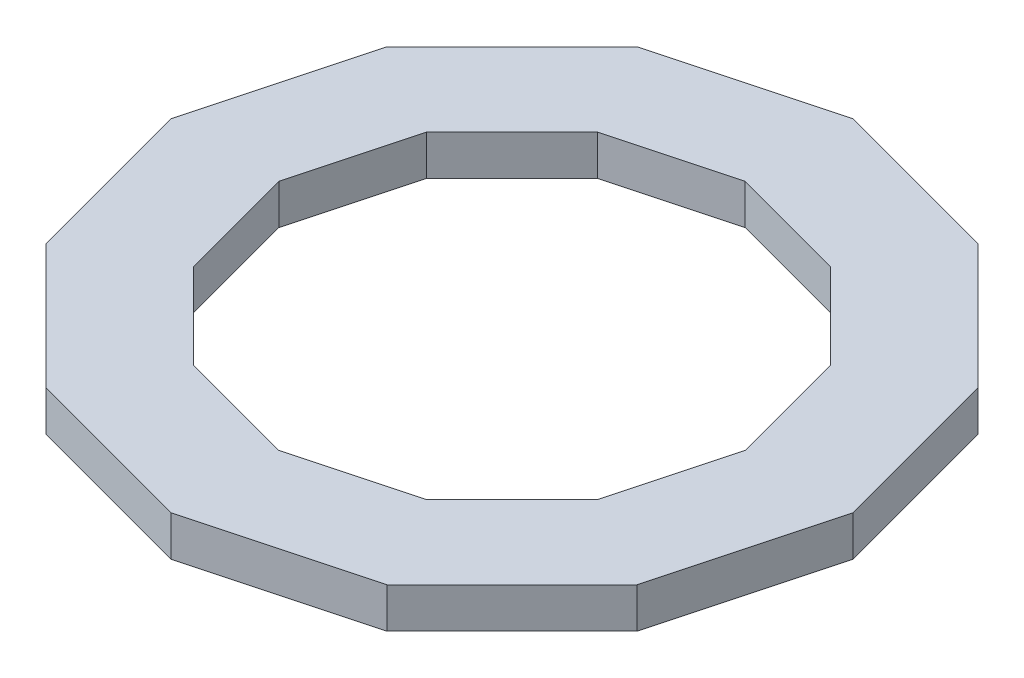
ISO-10303-21;
HEADER;
FILE_DESCRIPTION(('STEP AP214'),'2;1');
FILE_NAME('part.step','',(''),(''),'','','');
FILE_SCHEMA(('AUTOMOTIVE_DESIGN { 1 0 10303 214 1 1 1 1 }'));
ENDSEC;
DATA;
#1=APPLICATION_CONTEXT('core data for automotive mechanical design processes');
#2=APPLICATION_PROTOCOL_DEFINITION('international standard','automotive_design',2000,#1);
#3=PRODUCT_CONTEXT('',#1,'mechanical');
#4=PRODUCT('Part','Part','',(#3));
#5=PRODUCT_RELATED_PRODUCT_CATEGORY('part','',(#4));
#6=PRODUCT_DEFINITION_FORMATION('','',#4);
#7=PRODUCT_DEFINITION_CONTEXT('part definition',#1,'design');
#8=PRODUCT_DEFINITION('design','',#6,#7);
#9=PRODUCT_DEFINITION_SHAPE('','',#8);
#10=(LENGTH_UNIT() NAMED_UNIT(*) SI_UNIT(.MILLI.,.METRE.));
#11=(NAMED_UNIT(*) PLANE_ANGLE_UNIT() SI_UNIT($,.RADIAN.));
#12=(NAMED_UNIT(*) SI_UNIT($,.STERADIAN.) SOLID_ANGLE_UNIT());
#13=UNCERTAINTY_MEASURE_WITH_UNIT(LENGTH_MEASURE(1.E-05),#10,'distance_accuracy_value','');
#14=(GEOMETRIC_REPRESENTATION_CONTEXT(3) GLOBAL_UNCERTAINTY_ASSIGNED_CONTEXT((#13)) GLOBAL_UNIT_ASSIGNED_CONTEXT((#10,
#11,#12)) REPRESENTATION_CONTEXT('',''));
#15=CARTESIAN_POINT('',(0.,0.,0.));
#16=DIRECTION('',(0.,0.,1.));
#17=DIRECTION('',(1.,0.,0.));
#18=AXIS2_PLACEMENT_3D('',#15,#16,#17);
#19=CARTESIAN_POINT('',(0.,19.05,0.));
#20=DIRECTION('',(0.,1.,0.));
#21=DIRECTION('',(0.,0.,1.));
#22=AXIS2_PLACEMENT_3D('',#19,#20,#21);
#23=PLANE('',#22);
#24=DIRECTION('',(-0.258819045102521,0.,0.965925826289068));
#25=VECTOR('',#24,1.);
#26=CARTESIAN_POINT('',(-140.233593158606,19.05,-80.9639027595497));
#27=LINE('',#26,#25);
#28=CARTESIAN_POINT('',(-140.233593158606,19.05,-80.9639027595497));
#29=VERTEX_POINT('',#28);
#30=CARTESIAN_POINT('',(-161.927805519099,19.05,0.));
#31=VERTEX_POINT('',#30);
#32=EDGE_CURVE('E295',#29,#31,#27,.T.);
#33=ORIENTED_EDGE('',*,*,#32,.T.);
#34=DIRECTION('',(0.258819045102521,0.,0.965925826289068));
#35=VECTOR('',#34,1.);
#36=CARTESIAN_POINT('',(-161.927805519099,19.05,0.));
#37=LINE('',#36,#35);
#38=CARTESIAN_POINT('',(-140.233593158606,19.05,80.9639027595497));
#39=VERTEX_POINT('',#38);
#40=EDGE_CURVE('E298',#31,#39,#37,.T.);
#41=ORIENTED_EDGE('',*,*,#40,.T.);
#42=DIRECTION('',(0.707106781186547,0.,0.707106781186547));
#43=VECTOR('',#42,1.);
#44=CARTESIAN_POINT('',(-140.233593158606,19.05,80.9639027595497));
#45=LINE('',#44,#43);
#46=CARTESIAN_POINT('',(-80.9639027595497,19.05,140.233593158606));
#47=VERTEX_POINT('',#46);
#48=EDGE_CURVE('E302',#39,#47,#45,.T.);
#49=ORIENTED_EDGE('',*,*,#48,.T.);
#50=DIRECTION('',(0.965925826289068,0.,0.258819045102521));
#51=VECTOR('',#50,1.);
#52=CARTESIAN_POINT('',(-80.9639027595497,19.05,140.233593158606));
#53=LINE('',#52,#51);
#54=CARTESIAN_POINT('',(0.,19.05,161.927805519099));
#55=VERTEX_POINT('',#54);
#56=EDGE_CURVE('E304',#47,#55,#53,.T.);
#57=ORIENTED_EDGE('',*,*,#56,.T.);
#58=DIRECTION('',(0.965925826289068,0.,-0.258819045102521));
#59=VECTOR('',#58,1.);
#60=CARTESIAN_POINT('',(0.,19.05,161.927805519099));
#61=LINE('',#60,#59);
#62=CARTESIAN_POINT('',(80.9639027595496,19.05,140.233593158606));
#63=VERTEX_POINT('',#62);
#64=EDGE_CURVE('E306',#55,#63,#61,.T.);
#65=ORIENTED_EDGE('',*,*,#64,.T.);
#66=DIRECTION('',(0.707106781186547,0.,-0.707106781186548));
#67=VECTOR('',#66,1.);
#68=CARTESIAN_POINT('',(80.9639027595496,19.05,140.233593158606));
#69=LINE('',#68,#67);
#70=CARTESIAN_POINT('',(140.233593158606,19.05,80.9639027595496));
#71=VERTEX_POINT('',#70);
#72=EDGE_CURVE('E308',#63,#71,#69,.T.);
#73=ORIENTED_EDGE('',*,*,#72,.T.);
#74=DIRECTION('',(0.258819045102521,0.,-0.965925826289068));
#75=VECTOR('',#74,1.);
#76=CARTESIAN_POINT('',(140.233593158606,19.05,80.9639027595496));
#77=LINE('',#76,#75);
#78=CARTESIAN_POINT('',(161.927805519099,19.05,0.));
#79=VERTEX_POINT('',#78);
#80=EDGE_CURVE('E310',#71,#79,#77,.T.);
#81=ORIENTED_EDGE('',*,*,#80,.T.);
#82=DIRECTION('',(-0.258819045102521,0.,-0.965925826289068));
#83=VECTOR('',#82,1.);
#84=CARTESIAN_POINT('',(161.927805519099,19.05,0.));
#85=LINE('',#84,#83);
#86=CARTESIAN_POINT('',(140.233593158606,19.05,-80.9639027595496));
#87=VERTEX_POINT('',#86);
#88=EDGE_CURVE('E312',#79,#87,#85,.T.);
#89=ORIENTED_EDGE('',*,*,#88,.T.);
#90=DIRECTION('',(-0.707106781186547,0.,-0.707106781186548));
#91=VECTOR('',#90,1.);
#92=CARTESIAN_POINT('',(140.233593158606,19.05,-80.9639027595496));
#93=LINE('',#92,#91);
#94=CARTESIAN_POINT('',(80.9639027595496,19.05,-140.233593158606));
#95=VERTEX_POINT('',#94);
#96=EDGE_CURVE('E315',#87,#95,#93,.T.);
#97=ORIENTED_EDGE('',*,*,#96,.T.);
#98=DIRECTION('',(-0.965925826289068,0.,-0.258819045102521));
#99=VECTOR('',#98,1.);
#100=CARTESIAN_POINT('',(80.9639027595496,19.05,-140.233593158606));
#101=LINE('',#100,#99);
#102=CARTESIAN_POINT('',(0.,19.05,-161.927805519099));
#103=VERTEX_POINT('',#102);
#104=EDGE_CURVE('E317',#95,#103,#101,.T.);
#105=ORIENTED_EDGE('',*,*,#104,.T.);
#106=DIRECTION('',(-0.965925826289068,0.,0.258819045102521));
#107=VECTOR('',#106,1.);
#108=CARTESIAN_POINT('',(0.,19.05,-161.927805519099));
#109=LINE('',#108,#107);
#110=CARTESIAN_POINT('',(-80.9639027595496,19.05,-140.233593158606));
#111=VERTEX_POINT('',#110);
#112=EDGE_CURVE('E320',#103,#111,#109,.T.);
#113=ORIENTED_EDGE('',*,*,#112,.T.);
#114=DIRECTION('',(-0.707106781186548,0.,0.707106781186547));
#115=VECTOR('',#114,1.);
#116=CARTESIAN_POINT('',(-80.9639027595496,19.05,-140.233593158606));
#117=LINE('',#116,#115);
#118=EDGE_CURVE('E322',#111,#29,#117,.T.);
#119=ORIENTED_EDGE('',*,*,#118,.T.);
#120=EDGE_LOOP('',(#33,#41,#49,#57,#65,#73,#81,#89,#97,#105,#113,#119));
#121=FACE_BOUND('',#120,.T.);
#122=DIRECTION('',(0.258819045102521,0.,0.965925826289068));
#123=VECTOR('',#122,1.);
#124=CARTESIAN_POINT('',(-110.650576303388,19.05,0.));
#125=LINE('',#124,#123);
#126=CARTESIAN_POINT('',(-110.650576303388,19.05,0.));
#127=VERTEX_POINT('',#126);
#128=CARTESIAN_POINT('',(-95.8262100221223,19.05,55.3252881516939));
#129=VERTEX_POINT('',#128);
#130=EDGE_CURVE('E204',#127,#129,#125,.T.);
#131=ORIENTED_EDGE('',*,*,#130,.F.);
#132=DIRECTION('',(-0.258819045102521,0.,0.965925826289068));
#133=VECTOR('',#132,1.);
#134=CARTESIAN_POINT('',(-95.8262100221223,19.05,-55.3252881516939));
#135=LINE('',#134,#133);
#136=CARTESIAN_POINT('',(-95.8262100221223,19.05,-55.3252881516939));
#137=VERTEX_POINT('',#136);
#138=EDGE_CURVE('E196',#137,#127,#135,.T.);
#139=ORIENTED_EDGE('',*,*,#138,.F.);
#140=DIRECTION('',(-0.707106781186547,0.,0.707106781186548));
#141=VECTOR('',#140,1.);
#142=CARTESIAN_POINT('',(-55.3252881516939,19.05,-95.8262100221223));
#143=LINE('',#142,#141);
#144=CARTESIAN_POINT('',(-55.3252881516939,19.05,-95.8262100221223));
#145=VERTEX_POINT('',#144);
#146=EDGE_CURVE('E239',#145,#137,#143,.T.);
#147=ORIENTED_EDGE('',*,*,#146,.F.);
#148=DIRECTION('',(-0.965925826289068,0.,0.258819045102521));
#149=VECTOR('',#148,1.);
#150=CARTESIAN_POINT('',(0.,19.05,-110.650576303388));
#151=LINE('',#150,#149);
#152=CARTESIAN_POINT('',(0.,19.05,-110.650576303388));
#153=VERTEX_POINT('',#152);
#154=EDGE_CURVE('E236',#153,#145,#151,.T.);
#155=ORIENTED_EDGE('',*,*,#154,.F.);
#156=DIRECTION('',(-0.965925826289068,0.,-0.258819045102521));
#157=VECTOR('',#156,1.);
#158=CARTESIAN_POINT('',(55.3252881516939,19.05,-95.8262100221224));
#159=LINE('',#158,#157);
#160=CARTESIAN_POINT('',(55.3252881516939,19.05,-95.8262100221224));
#161=VERTEX_POINT('',#160);
#162=EDGE_CURVE('E234',#161,#153,#159,.T.);
#163=ORIENTED_EDGE('',*,*,#162,.F.);
#164=DIRECTION('',(-0.707106781186548,0.,-0.707106781186547));
#165=VECTOR('',#164,1.);
#166=CARTESIAN_POINT('',(95.8262100221223,19.05,-55.3252881516939));
#167=LINE('',#166,#165);
#168=CARTESIAN_POINT('',(95.8262100221223,19.05,-55.3252881516939));
#169=VERTEX_POINT('',#168);
#170=EDGE_CURVE('E232',#169,#161,#167,.T.);
#171=ORIENTED_EDGE('',*,*,#170,.F.);
#172=DIRECTION('',(-0.258819045102521,0.,-0.965925826289068));
#173=VECTOR('',#172,1.);
#174=CARTESIAN_POINT('',(110.650576303388,19.05,0.));
#175=LINE('',#174,#173);
#176=CARTESIAN_POINT('',(110.650576303388,19.05,0.));
#177=VERTEX_POINT('',#176);
#178=EDGE_CURVE('E230',#177,#169,#175,.T.);
#179=ORIENTED_EDGE('',*,*,#178,.F.);
#180=DIRECTION('',(0.258819045102521,0.,-0.965925826289068));
#181=VECTOR('',#180,1.);
#182=CARTESIAN_POINT('',(95.8262100221223,19.05,55.3252881516939));
#183=LINE('',#182,#181);
#184=CARTESIAN_POINT('',(95.8262100221223,19.05,55.3252881516939));
#185=VERTEX_POINT('',#184);
#186=EDGE_CURVE('E228',#185,#177,#183,.T.);
#187=ORIENTED_EDGE('',*,*,#186,.F.);
#188=DIRECTION('',(0.707106781186547,0.,-0.707106781186548));
#189=VECTOR('',#188,1.);
#190=CARTESIAN_POINT('',(55.3252881516939,19.05,95.8262100221223));
#191=LINE('',#190,#189);
#192=CARTESIAN_POINT('',(55.3252881516939,19.05,95.8262100221223));
#193=VERTEX_POINT('',#192);
#194=EDGE_CURVE('E226',#193,#185,#191,.T.);
#195=ORIENTED_EDGE('',*,*,#194,.F.);
#196=DIRECTION('',(0.965925826289068,0.,-0.258819045102521));
#197=VECTOR('',#196,1.);
#198=CARTESIAN_POINT('',(0.,19.05,110.650576303388));
#199=LINE('',#198,#197);
#200=CARTESIAN_POINT('',(0.,19.05,110.650576303388));
#201=VERTEX_POINT('',#200);
#202=EDGE_CURVE('E223',#201,#193,#199,.T.);
#203=ORIENTED_EDGE('',*,*,#202,.F.);
#204=DIRECTION('',(0.965925826289068,0.,0.258819045102521));
#205=VECTOR('',#204,1.);
#206=CARTESIAN_POINT('',(-55.3252881516939,19.05,95.8262100221223));
#207=LINE('',#206,#205);
#208=CARTESIAN_POINT('',(-55.3252881516939,19.05,95.8262100221223));
#209=VERTEX_POINT('',#208);
#210=EDGE_CURVE('E219',#209,#201,#207,.T.);
#211=ORIENTED_EDGE('',*,*,#210,.F.);
#212=DIRECTION('',(0.707106781186548,0.,0.707106781186547));
#213=VECTOR('',#212,1.);
#214=CARTESIAN_POINT('',(-95.8262100221223,19.05,55.3252881516939));
#215=LINE('',#214,#213);
#216=EDGE_CURVE('E217',#129,#209,#215,.T.);
#217=ORIENTED_EDGE('',*,*,#216,.F.);
#218=EDGE_LOOP('',(#131,#139,#147,#155,#163,#171,#179,#187,#195,#203,#211,#217));
#219=FACE_BOUND('',#218,.T.);
#220=ADVANCED_FACE('F35',(#121,#219),#23,.T.);
#221=CARTESIAN_POINT('',(0.,0.,0.));
#222=DIRECTION('',(0.,1.,0.));
#223=DIRECTION('',(0.,0.,1.));
#224=AXIS2_PLACEMENT_3D('',#221,#222,#223);
#225=PLANE('',#224);
#226=DIRECTION('',(-0.258819045102521,0.,0.965925826289068));
#227=VECTOR('',#226,1.);
#228=CARTESIAN_POINT('',(-140.233593158606,0.,-80.9639027595497));
#229=LINE('',#228,#227);
#230=CARTESIAN_POINT('',(-140.233593158606,0.,-80.9639027595497));
#231=VERTEX_POINT('',#230);
#232=CARTESIAN_POINT('',(-161.927805519099,0.,0.));
#233=VERTEX_POINT('',#232);
#234=EDGE_CURVE('E212',#231,#233,#229,.T.);
#235=ORIENTED_EDGE('',*,*,#234,.F.);
#236=DIRECTION('',(-0.707106781186548,0.,0.707106781186547));
#237=VECTOR('',#236,1.);
#238=CARTESIAN_POINT('',(-80.9639027595496,0.,-140.233593158606));
#239=LINE('',#238,#237);
#240=CARTESIAN_POINT('',(-80.9639027595496,0.,-140.233593158606));
#241=VERTEX_POINT('',#240);
#242=EDGE_CURVE('E299',#241,#231,#239,.T.);
#243=ORIENTED_EDGE('',*,*,#242,.F.);
#244=DIRECTION('',(-0.965925826289068,0.,0.258819045102521));
#245=VECTOR('',#244,1.);
#246=CARTESIAN_POINT('',(0.,0.,-161.927805519099));
#247=LINE('',#246,#245);
#248=CARTESIAN_POINT('',(0.,0.,-161.927805519099));
#249=VERTEX_POINT('',#248);
#250=EDGE_CURVE('E347',#249,#241,#247,.T.);
#251=ORIENTED_EDGE('',*,*,#250,.F.);
#252=DIRECTION('',(-0.965925826289068,0.,-0.258819045102521));
#253=VECTOR('',#252,1.);
#254=CARTESIAN_POINT('',(80.9639027595496,0.,-140.233593158606));
#255=LINE('',#254,#253);
#256=CARTESIAN_POINT('',(80.9639027595496,0.,-140.233593158606));
#257=VERTEX_POINT('',#256);
#258=EDGE_CURVE('E344',#257,#249,#255,.T.);
#259=ORIENTED_EDGE('',*,*,#258,.F.);
#260=DIRECTION('',(-0.707106781186547,0.,-0.707106781186548));
#261=VECTOR('',#260,1.);
#262=CARTESIAN_POINT('',(140.233593158606,0.,-80.9639027595496));
#263=LINE('',#262,#261);
#264=CARTESIAN_POINT('',(140.233593158606,0.,-80.9639027595496));
#265=VERTEX_POINT('',#264);
#266=EDGE_CURVE('E342',#265,#257,#263,.T.);
#267=ORIENTED_EDGE('',*,*,#266,.F.);
#268=DIRECTION('',(-0.258819045102521,0.,-0.965925826289068));
#269=VECTOR('',#268,1.);
#270=CARTESIAN_POINT('',(161.927805519099,0.,0.));
#271=LINE('',#270,#269);
#272=CARTESIAN_POINT('',(161.927805519099,0.,0.));
#273=VERTEX_POINT('',#272);
#274=EDGE_CURVE('E340',#273,#265,#271,.T.);
#275=ORIENTED_EDGE('',*,*,#274,.F.);
#276=DIRECTION('',(0.258819045102521,0.,-0.965925826289068));
#277=VECTOR('',#276,1.);
#278=CARTESIAN_POINT('',(140.233593158606,0.,80.9639027595496));
#279=LINE('',#278,#277);
#280=CARTESIAN_POINT('',(140.233593158606,0.,80.9639027595496));
#281=VERTEX_POINT('',#280);
#282=EDGE_CURVE('E338',#281,#273,#279,.T.);
#283=ORIENTED_EDGE('',*,*,#282,.F.);
#284=DIRECTION('',(0.707106781186547,0.,-0.707106781186548));
#285=VECTOR('',#284,1.);
#286=CARTESIAN_POINT('',(80.9639027595496,0.,140.233593158606));
#287=LINE('',#286,#285);
#288=CARTESIAN_POINT('',(80.9639027595496,0.,140.233593158606));
#289=VERTEX_POINT('',#288);
#290=EDGE_CURVE('E336',#289,#281,#287,.T.);
#291=ORIENTED_EDGE('',*,*,#290,.F.);
#292=DIRECTION('',(0.965925826289068,0.,-0.258819045102521));
#293=VECTOR('',#292,1.);
#294=CARTESIAN_POINT('',(0.,0.,161.927805519099));
#295=LINE('',#294,#293);
#296=CARTESIAN_POINT('',(0.,0.,161.927805519099));
#297=VERTEX_POINT('',#296);
#298=EDGE_CURVE('E334',#297,#289,#295,.T.);
#299=ORIENTED_EDGE('',*,*,#298,.F.);
#300=DIRECTION('',(0.965925826289068,0.,0.258819045102521));
#301=VECTOR('',#300,1.);
#302=CARTESIAN_POINT('',(-80.9639027595497,0.,140.233593158606));
#303=LINE('',#302,#301);
#304=CARTESIAN_POINT('',(-80.9639027595497,0.,140.233593158606));
#305=VERTEX_POINT('',#304);
#306=EDGE_CURVE('E331',#305,#297,#303,.T.);
#307=ORIENTED_EDGE('',*,*,#306,.F.);
#308=DIRECTION('',(0.707106781186547,0.,0.707106781186547));
#309=VECTOR('',#308,1.);
#310=CARTESIAN_POINT('',(-140.233593158606,0.,80.9639027595497));
#311=LINE('',#310,#309);
#312=CARTESIAN_POINT('',(-140.233593158606,0.,80.9639027595497));
#313=VERTEX_POINT('',#312);
#314=EDGE_CURVE('E329',#313,#305,#311,.T.);
#315=ORIENTED_EDGE('',*,*,#314,.F.);
#316=DIRECTION('',(0.258819045102521,0.,0.965925826289068));
#317=VECTOR('',#316,1.);
#318=CARTESIAN_POINT('',(-161.927805519099,0.,0.));
#319=LINE('',#318,#317);
#320=EDGE_CURVE('E327',#233,#313,#319,.T.);
#321=ORIENTED_EDGE('',*,*,#320,.F.);
#322=EDGE_LOOP('',(#235,#243,#251,#259,#267,#275,#283,#291,#299,#307,#315,#321));
#323=FACE_BOUND('',#322,.T.);
#324=DIRECTION('',(-0.258819045102521,0.,0.965925826289068));
#325=VECTOR('',#324,1.);
#326=CARTESIAN_POINT('',(-95.8262100221223,0.,-55.3252881516939));
#327=LINE('',#326,#325);
#328=CARTESIAN_POINT('',(-95.8262100221223,0.,-55.3252881516939));
#329=VERTEX_POINT('',#328);
#330=CARTESIAN_POINT('',(-110.650576303388,0.,0.));
#331=VERTEX_POINT('',#330);
#332=EDGE_CURVE('E58',#329,#331,#327,.T.);
#333=ORIENTED_EDGE('',*,*,#332,.T.);
#334=DIRECTION('',(0.258819045102521,0.,0.965925826289068));
#335=VECTOR('',#334,1.);
#336=CARTESIAN_POINT('',(-110.650576303388,0.,0.));
#337=LINE('',#336,#335);
#338=CARTESIAN_POINT('',(-95.8262100221223,0.,55.3252881516939));
#339=VERTEX_POINT('',#338);
#340=EDGE_CURVE('E211',#331,#339,#337,.T.);
#341=ORIENTED_EDGE('',*,*,#340,.T.);
#342=DIRECTION('',(0.707106781186548,0.,0.707106781186547));
#343=VECTOR('',#342,1.);
#344=CARTESIAN_POINT('',(-95.8262100221223,0.,55.3252881516939));
#345=LINE('',#344,#343);
#346=CARTESIAN_POINT('',(-55.3252881516939,0.,95.8262100221223));
#347=VERTEX_POINT('',#346);
#348=EDGE_CURVE('E243',#339,#347,#345,.T.);
#349=ORIENTED_EDGE('',*,*,#348,.T.);
#350=DIRECTION('',(0.965925826289068,0.,0.258819045102521));
#351=VECTOR('',#350,1.);
#352=CARTESIAN_POINT('',(-55.3252881516939,0.,95.8262100221223));
#353=LINE('',#352,#351);
#354=CARTESIAN_POINT('',(0.,0.,110.650576303388));
#355=VERTEX_POINT('',#354);
#356=EDGE_CURVE('E246',#347,#355,#353,.T.);
#357=ORIENTED_EDGE('',*,*,#356,.T.);
#358=DIRECTION('',(0.965925826289068,0.,-0.258819045102521));
#359=VECTOR('',#358,1.);
#360=CARTESIAN_POINT('',(0.,0.,110.650576303388));
#361=LINE('',#360,#359);
#362=CARTESIAN_POINT('',(55.3252881516939,0.,95.8262100221223));
#363=VERTEX_POINT('',#362);
#364=EDGE_CURVE('E249',#355,#363,#361,.T.);
#365=ORIENTED_EDGE('',*,*,#364,.T.);
#366=DIRECTION('',(0.707106781186547,0.,-0.707106781186548));
#367=VECTOR('',#366,1.);
#368=CARTESIAN_POINT('',(55.3252881516939,0.,95.8262100221223));
#369=LINE('',#368,#367);
#370=CARTESIAN_POINT('',(95.8262100221223,0.,55.3252881516939));
#371=VERTEX_POINT('',#370);
#372=EDGE_CURVE('E252',#363,#371,#369,.T.);
#373=ORIENTED_EDGE('',*,*,#372,.T.);
#374=DIRECTION('',(0.258819045102521,0.,-0.965925826289068));
#375=VECTOR('',#374,1.);
#376=CARTESIAN_POINT('',(95.8262100221223,0.,55.3252881516939));
#377=LINE('',#376,#375);
#378=CARTESIAN_POINT('',(110.650576303388,0.,0.));
#379=VERTEX_POINT('',#378);
#380=EDGE_CURVE('E255',#371,#379,#377,.T.);
#381=ORIENTED_EDGE('',*,*,#380,.T.);
#382=DIRECTION('',(-0.258819045102521,0.,-0.965925826289068));
#383=VECTOR('',#382,1.);
#384=CARTESIAN_POINT('',(110.650576303388,0.,0.));
#385=LINE('',#384,#383);
#386=CARTESIAN_POINT('',(95.8262100221223,0.,-55.3252881516939));
#387=VERTEX_POINT('',#386);
#388=EDGE_CURVE('E258',#379,#387,#385,.T.);
#389=ORIENTED_EDGE('',*,*,#388,.T.);
#390=DIRECTION('',(-0.707106781186548,0.,-0.707106781186547));
#391=VECTOR('',#390,1.);
#392=CARTESIAN_POINT('',(95.8262100221223,0.,-55.3252881516939));
#393=LINE('',#392,#391);
#394=CARTESIAN_POINT('',(55.3252881516939,0.,-95.8262100221224));
#395=VERTEX_POINT('',#394);
#396=EDGE_CURVE('E261',#387,#395,#393,.T.);
#397=ORIENTED_EDGE('',*,*,#396,.T.);
#398=DIRECTION('',(-0.965925826289068,0.,-0.258819045102521));
#399=VECTOR('',#398,1.);
#400=CARTESIAN_POINT('',(55.3252881516939,0.,-95.8262100221224));
#401=LINE('',#400,#399);
#402=CARTESIAN_POINT('',(0.,0.,-110.650576303388));
#403=VERTEX_POINT('',#402);
#404=EDGE_CURVE('E264',#395,#403,#401,.T.);
#405=ORIENTED_EDGE('',*,*,#404,.T.);
#406=DIRECTION('',(-0.965925826289068,0.,0.258819045102521));
#407=VECTOR('',#406,1.);
#408=CARTESIAN_POINT('',(0.,0.,-110.650576303388));
#409=LINE('',#408,#407);
#410=CARTESIAN_POINT('',(-55.3252881516939,0.,-95.8262100221223));
#411=VERTEX_POINT('',#410);
#412=EDGE_CURVE('E267',#403,#411,#409,.T.);
#413=ORIENTED_EDGE('',*,*,#412,.T.);
#414=DIRECTION('',(-0.707106781186547,0.,0.707106781186548));
#415=VECTOR('',#414,1.);
#416=CARTESIAN_POINT('',(-55.3252881516939,0.,-95.8262100221223));
#417=LINE('',#416,#415);
#418=EDGE_CURVE('E205',#411,#329,#417,.T.);
#419=ORIENTED_EDGE('',*,*,#418,.T.);
#420=EDGE_LOOP('',(#333,#341,#349,#357,#365,#373,#381,#389,#397,#405,#413,#419));
#421=FACE_BOUND('',#420,.T.);
#422=ADVANCED_FACE('F389',(#323,#421),#225,.F.);
#423=CARTESIAN_POINT('',(-140.233593158606,19.05,-80.9639027595497));
#424=DIRECTION('',(0.965925826289068,0.,0.258819045102521));
#425=DIRECTION('',(0.258819045102521,0.,-0.965925826289068));
#426=AXIS2_PLACEMENT_3D('',#423,#424,#425);
#427=PLANE('',#426);
#428=ORIENTED_EDGE('',*,*,#234,.T.);
#429=DIRECTION('',(0.,-1.,0.));
#430=VECTOR('',#429,1.);
#431=CARTESIAN_POINT('',(-161.927805519099,19.05,0.));
#432=LINE('',#431,#430);
#433=EDGE_CURVE('E11',#31,#233,#432,.T.);
#434=ORIENTED_EDGE('',*,*,#433,.F.);
#435=ORIENTED_EDGE('',*,*,#32,.F.);
#436=DIRECTION('',(0.,-1.,0.));
#437=VECTOR('',#436,1.);
#438=CARTESIAN_POINT('',(-140.233593158606,19.05,-80.9639027595497));
#439=LINE('',#438,#437);
#440=EDGE_CURVE('E324',#29,#231,#439,.T.);
#441=ORIENTED_EDGE('',*,*,#440,.T.);
#442=EDGE_LOOP('',(#428,#434,#435,#441));
#443=FACE_BOUND('',#442,.T.);
#444=ADVANCED_FACE('F37',(#443),#427,.F.);
#445=CARTESIAN_POINT('',(-161.927805519099,19.05,0.));
#446=DIRECTION('',(0.965925826289068,0.,-0.258819045102521));
#447=DIRECTION('',(-0.258819045102521,0.,-0.965925826289068));
#448=AXIS2_PLACEMENT_3D('',#445,#446,#447);
#449=PLANE('',#448);
#450=ORIENTED_EDGE('',*,*,#320,.T.);
#451=DIRECTION('',(0.,-1.,0.));
#452=VECTOR('',#451,1.);
#453=CARTESIAN_POINT('',(-140.233593158606,19.05,80.9639027595497));
#454=LINE('',#453,#452);
#455=EDGE_CURVE('E43',#39,#313,#454,.T.);
#456=ORIENTED_EDGE('',*,*,#455,.F.);
#457=ORIENTED_EDGE('',*,*,#40,.F.);
#458=ORIENTED_EDGE('',*,*,#433,.T.);
#459=EDGE_LOOP('',(#450,#456,#457,#458));
#460=FACE_BOUND('',#459,.T.);
#461=ADVANCED_FACE('F406',(#460),#449,.F.);
#462=CARTESIAN_POINT('',(-140.233593158606,19.05,80.9639027595497));
#463=DIRECTION('',(0.707106781186547,0.,-0.707106781186547));
#464=DIRECTION('',(-0.707106781186548,0.,-0.707106781186548));
#465=AXIS2_PLACEMENT_3D('',#462,#463,#464);
#466=PLANE('',#465);
#467=ORIENTED_EDGE('',*,*,#314,.T.);
#468=DIRECTION('',(0.,-1.,0.));
#469=VECTOR('',#468,1.);
#470=CARTESIAN_POINT('',(-80.9639027595497,19.05,140.233593158606));
#471=LINE('',#470,#469);
#472=EDGE_CURVE('E376',#47,#305,#471,.T.);
#473=ORIENTED_EDGE('',*,*,#472,.F.);
#474=ORIENTED_EDGE('',*,*,#48,.F.);
#475=ORIENTED_EDGE('',*,*,#455,.T.);
#476=EDGE_LOOP('',(#467,#473,#474,#475));
#477=FACE_BOUND('',#476,.T.);
#478=ADVANCED_FACE('F383',(#477),#466,.F.);
#479=CARTESIAN_POINT('',(-80.9639027595497,19.05,140.233593158606));
#480=DIRECTION('',(0.258819045102521,0.,-0.965925826289068));
#481=DIRECTION('',(-0.965925826289068,0.,-0.258819045102521));
#482=AXIS2_PLACEMENT_3D('',#479,#480,#481);
#483=PLANE('',#482);
#484=ORIENTED_EDGE('',*,*,#306,.T.);
#485=DIRECTION('',(0.,-1.,0.));
#486=VECTOR('',#485,1.);
#487=CARTESIAN_POINT('',(0.,19.05,161.927805519099));
#488=LINE('',#487,#486);
#489=EDGE_CURVE('E373',#55,#297,#488,.T.);
#490=ORIENTED_EDGE('',*,*,#489,.F.);
#491=ORIENTED_EDGE('',*,*,#56,.F.);
#492=ORIENTED_EDGE('',*,*,#472,.T.);
#493=EDGE_LOOP('',(#484,#490,#491,#492));
#494=FACE_BOUND('',#493,.T.);
#495=ADVANCED_FACE('F395',(#494),#483,.F.);
#496=CARTESIAN_POINT('',(0.,19.05,161.927805519099));
#497=DIRECTION('',(-0.258819045102521,0.,-0.965925826289068));
#498=DIRECTION('',(-0.965925826289068,0.,0.258819045102521));
#499=AXIS2_PLACEMENT_3D('',#496,#497,#498);
#500=PLANE('',#499);
#501=ORIENTED_EDGE('',*,*,#298,.T.);
#502=DIRECTION('',(0.,-1.,0.));
#503=VECTOR('',#502,1.);
#504=CARTESIAN_POINT('',(80.9639027595496,19.05,140.233593158606));
#505=LINE('',#504,#503);
#506=EDGE_CURVE('E370',#63,#289,#505,.T.);
#507=ORIENTED_EDGE('',*,*,#506,.F.);
#508=ORIENTED_EDGE('',*,*,#64,.F.);
#509=ORIENTED_EDGE('',*,*,#489,.T.);
#510=EDGE_LOOP('',(#501,#507,#508,#509));
#511=FACE_BOUND('',#510,.T.);
#512=ADVANCED_FACE('F399',(#511),#500,.F.);
#513=CARTESIAN_POINT('',(80.9639027595496,19.05,140.233593158606));
#514=DIRECTION('',(-0.707106781186548,0.,-0.707106781186547));
#515=DIRECTION('',(-0.707106781186547,0.,0.707106781186548));
#516=AXIS2_PLACEMENT_3D('',#513,#514,#515);
#517=PLANE('',#516);
#518=ORIENTED_EDGE('',*,*,#290,.T.);
#519=DIRECTION('',(0.,-1.,0.));
#520=VECTOR('',#519,1.);
#521=CARTESIAN_POINT('',(140.233593158606,19.05,80.9639027595496));
#522=LINE('',#521,#520);
#523=EDGE_CURVE('E367',#71,#281,#522,.T.);
#524=ORIENTED_EDGE('',*,*,#523,.F.);
#525=ORIENTED_EDGE('',*,*,#72,.F.);
#526=ORIENTED_EDGE('',*,*,#506,.T.);
#527=EDGE_LOOP('',(#518,#524,#525,#526));
#528=FACE_BOUND('',#527,.T.);
#529=ADVANCED_FACE('F439',(#528),#517,.F.);
#530=CARTESIAN_POINT('',(140.233593158606,19.05,80.9639027595496));
#531=DIRECTION('',(-0.965925826289068,0.,-0.258819045102521));
#532=DIRECTION('',(-0.258819045102521,0.,0.965925826289068));
#533=AXIS2_PLACEMENT_3D('',#530,#531,#532);
#534=PLANE('',#533);
#535=ORIENTED_EDGE('',*,*,#282,.T.);
#536=DIRECTION('',(0.,-1.,0.));
#537=VECTOR('',#536,1.);
#538=CARTESIAN_POINT('',(161.927805519099,19.05,0.));
#539=LINE('',#538,#537);
#540=EDGE_CURVE('E364',#79,#273,#539,.T.);
#541=ORIENTED_EDGE('',*,*,#540,.F.);
#542=ORIENTED_EDGE('',*,*,#80,.F.);
#543=ORIENTED_EDGE('',*,*,#523,.T.);
#544=EDGE_LOOP('',(#535,#541,#542,#543));
#545=FACE_BOUND('',#544,.T.);
#546=ADVANCED_FACE('F437',(#545),#534,.F.);
#547=CARTESIAN_POINT('',(161.927805519099,19.05,0.));
#548=DIRECTION('',(-0.965925826289068,0.,0.258819045102521));
#549=DIRECTION('',(0.258819045102521,0.,0.965925826289068));
#550=AXIS2_PLACEMENT_3D('',#547,#548,#549);
#551=PLANE('',#550);
#552=ORIENTED_EDGE('',*,*,#274,.T.);
#553=DIRECTION('',(0.,-1.,0.));
#554=VECTOR('',#553,1.);
#555=CARTESIAN_POINT('',(140.233593158606,19.05,-80.9639027595496));
#556=LINE('',#555,#554);
#557=EDGE_CURVE('E361',#87,#265,#556,.T.);
#558=ORIENTED_EDGE('',*,*,#557,.F.);
#559=ORIENTED_EDGE('',*,*,#88,.F.);
#560=ORIENTED_EDGE('',*,*,#540,.T.);
#561=EDGE_LOOP('',(#552,#558,#559,#560));
#562=FACE_BOUND('',#561,.T.);
#563=ADVANCED_FACE('F433',(#562),#551,.F.);
#564=CARTESIAN_POINT('',(140.233593158606,19.05,-80.9639027595496));
#565=DIRECTION('',(-0.707106781186548,0.,0.707106781186547));
#566=DIRECTION('',(0.707106781186547,0.,0.707106781186548));
#567=AXIS2_PLACEMENT_3D('',#564,#565,#566);
#568=PLANE('',#567);
#569=ORIENTED_EDGE('',*,*,#266,.T.);
#570=DIRECTION('',(0.,-1.,0.));
#571=VECTOR('',#570,1.);
#572=CARTESIAN_POINT('',(80.9639027595496,19.05,-140.233593158606));
#573=LINE('',#572,#571);
#574=EDGE_CURVE('E358',#95,#257,#573,.T.);
#575=ORIENTED_EDGE('',*,*,#574,.F.);
#576=ORIENTED_EDGE('',*,*,#96,.F.);
#577=ORIENTED_EDGE('',*,*,#557,.T.);
#578=EDGE_LOOP('',(#569,#575,#576,#577));
#579=FACE_BOUND('',#578,.T.);
#580=ADVANCED_FACE('F428',(#579),#568,.F.);
#581=CARTESIAN_POINT('',(80.9639027595496,19.05,-140.233593158606));
#582=DIRECTION('',(-0.258819045102521,0.,0.965925826289068));
#583=DIRECTION('',(0.965925826289068,0.,0.258819045102521));
#584=AXIS2_PLACEMENT_3D('',#581,#582,#583);
#585=PLANE('',#584);
#586=ORIENTED_EDGE('',*,*,#258,.T.);
#587=DIRECTION('',(0.,-1.,0.));
#588=VECTOR('',#587,1.);
#589=CARTESIAN_POINT('',(0.,19.05,-161.927805519099));
#590=LINE('',#589,#588);
#591=EDGE_CURVE('E355',#103,#249,#590,.T.);
#592=ORIENTED_EDGE('',*,*,#591,.F.);
#593=ORIENTED_EDGE('',*,*,#104,.F.);
#594=ORIENTED_EDGE('',*,*,#574,.T.);
#595=EDGE_LOOP('',(#586,#592,#593,#594));
#596=FACE_BOUND('',#595,.T.);
#597=ADVANCED_FACE('F422',(#596),#585,.F.);
#598=CARTESIAN_POINT('',(0.,19.05,-161.927805519099));
#599=DIRECTION('',(0.258819045102521,0.,0.965925826289068));
#600=DIRECTION('',(0.965925826289068,0.,-0.258819045102521));
#601=AXIS2_PLACEMENT_3D('',#598,#599,#600);
#602=PLANE('',#601);
#603=ORIENTED_EDGE('',*,*,#250,.T.);
#604=DIRECTION('',(0.,-1.,0.));
#605=VECTOR('',#604,1.);
#606=CARTESIAN_POINT('',(-80.9639027595496,19.05,-140.233593158606));
#607=LINE('',#606,#605);
#608=EDGE_CURVE('E352',#111,#241,#607,.T.);
#609=ORIENTED_EDGE('',*,*,#608,.F.);
#610=ORIENTED_EDGE('',*,*,#112,.F.);
#611=ORIENTED_EDGE('',*,*,#591,.T.);
#612=EDGE_LOOP('',(#603,#609,#610,#611));
#613=FACE_BOUND('',#612,.T.);
#614=ADVANCED_FACE('F418',(#613),#602,.F.);
#615=CARTESIAN_POINT('',(-80.9639027595496,19.05,-140.233593158606));
#616=DIRECTION('',(0.707106781186547,0.,0.707106781186548));
#617=DIRECTION('',(0.707106781186548,0.,-0.707106781186547));
#618=AXIS2_PLACEMENT_3D('',#615,#616,#617);
#619=PLANE('',#618);
#620=ORIENTED_EDGE('',*,*,#242,.T.);
#621=ORIENTED_EDGE('',*,*,#440,.F.);
#622=ORIENTED_EDGE('',*,*,#118,.F.);
#623=ORIENTED_EDGE('',*,*,#608,.T.);
#624=EDGE_LOOP('',(#620,#621,#622,#623));
#625=FACE_BOUND('',#624,.T.);
#626=ADVANCED_FACE('F413',(#625),#619,.F.);
#627=CARTESIAN_POINT('',(-95.8262100221223,19.05,-55.3252881516939));
#628=DIRECTION('',(0.965925826289068,0.,0.258819045102521));
#629=DIRECTION('',(0.258819045102521,0.,-0.965925826289068));
#630=AXIS2_PLACEMENT_3D('',#627,#628,#629);
#631=PLANE('',#630);
#632=ORIENTED_EDGE('',*,*,#332,.F.);
#633=DIRECTION('',(0.,-1.,0.));
#634=VECTOR('',#633,1.);
#635=CARTESIAN_POINT('',(-95.8262100221223,19.05,-55.3252881516939));
#636=LINE('',#635,#634);
#637=EDGE_CURVE('E200',#137,#329,#636,.T.);
#638=ORIENTED_EDGE('',*,*,#637,.F.);
#639=ORIENTED_EDGE('',*,*,#138,.T.);
#640=DIRECTION('',(0.,-1.,0.));
#641=VECTOR('',#640,1.);
#642=CARTESIAN_POINT('',(-110.650576303388,19.05,0.));
#643=LINE('',#642,#641);
#644=EDGE_CURVE('E199',#127,#331,#643,.T.);
#645=ORIENTED_EDGE('',*,*,#644,.T.);
#646=EDGE_LOOP('',(#632,#638,#639,#645));
#647=FACE_BOUND('',#646,.T.);
#648=ADVANCED_FACE('F198',(#647),#631,.T.);
#649=CARTESIAN_POINT('',(-110.650576303388,19.05,0.));
#650=DIRECTION('',(0.965925826289068,0.,-0.258819045102521));
#651=DIRECTION('',(-0.258819045102521,0.,-0.965925826289068));
#652=AXIS2_PLACEMENT_3D('',#649,#650,#651);
#653=PLANE('',#652);
#654=ORIENTED_EDGE('',*,*,#340,.F.);
#655=ORIENTED_EDGE('',*,*,#644,.F.);
#656=ORIENTED_EDGE('',*,*,#130,.T.);
#657=DIRECTION('',(0.,-1.,0.));
#658=VECTOR('',#657,1.);
#659=CARTESIAN_POINT('',(-95.8262100221223,19.05,55.3252881516939));
#660=LINE('',#659,#658);
#661=EDGE_CURVE('E213',#129,#339,#660,.T.);
#662=ORIENTED_EDGE('',*,*,#661,.T.);
#663=EDGE_LOOP('',(#654,#655,#656,#662));
#664=FACE_BOUND('',#663,.T.);
#665=ADVANCED_FACE('F208',(#664),#653,.T.);
#666=CARTESIAN_POINT('',(-95.8262100221223,19.05,55.3252881516939));
#667=DIRECTION('',(0.707106781186547,0.,-0.707106781186548));
#668=DIRECTION('',(-0.707106781186548,0.,-0.707106781186547));
#669=AXIS2_PLACEMENT_3D('',#666,#667,#668);
#670=PLANE('',#669);
#671=ORIENTED_EDGE('',*,*,#348,.F.);
#672=ORIENTED_EDGE('',*,*,#661,.F.);
#673=ORIENTED_EDGE('',*,*,#216,.T.);
#674=DIRECTION('',(0.,-1.,0.));
#675=VECTOR('',#674,1.);
#676=CARTESIAN_POINT('',(-55.3252881516939,19.05,95.8262100221223));
#677=LINE('',#676,#675);
#678=EDGE_CURVE('E291',#209,#347,#677,.T.);
#679=ORIENTED_EDGE('',*,*,#678,.T.);
#680=EDGE_LOOP('',(#671,#672,#673,#679));
#681=FACE_BOUND('',#680,.T.);
#682=ADVANCED_FACE('F497',(#681),#670,.T.);
#683=CARTESIAN_POINT('',(-55.3252881516939,19.05,95.8262100221223));
#684=DIRECTION('',(0.258819045102521,0.,-0.965925826289068));
#685=DIRECTION('',(-0.965925826289068,0.,-0.258819045102521));
#686=AXIS2_PLACEMENT_3D('',#683,#684,#685);
#687=PLANE('',#686);
#688=ORIENTED_EDGE('',*,*,#356,.F.);
#689=ORIENTED_EDGE('',*,*,#678,.F.);
#690=ORIENTED_EDGE('',*,*,#210,.T.);
#691=DIRECTION('',(0.,-1.,0.));
#692=VECTOR('',#691,1.);
#693=CARTESIAN_POINT('',(0.,19.05,110.650576303388));
#694=LINE('',#693,#692);
#695=EDGE_CURVE('E289',#201,#355,#694,.T.);
#696=ORIENTED_EDGE('',*,*,#695,.T.);
#697=EDGE_LOOP('',(#688,#689,#690,#696));
#698=FACE_BOUND('',#697,.T.);
#699=ADVANCED_FACE('F503',(#698),#687,.T.);
#700=CARTESIAN_POINT('',(0.,19.05,110.650576303388));
#701=DIRECTION('',(-0.258819045102521,0.,-0.965925826289068));
#702=DIRECTION('',(-0.965925826289068,0.,0.258819045102521));
#703=AXIS2_PLACEMENT_3D('',#700,#701,#702);
#704=PLANE('',#703);
#705=ORIENTED_EDGE('',*,*,#364,.F.);
#706=ORIENTED_EDGE('',*,*,#695,.F.);
#707=ORIENTED_EDGE('',*,*,#202,.T.);
#708=DIRECTION('',(0.,-1.,0.));
#709=VECTOR('',#708,1.);
#710=CARTESIAN_POINT('',(55.3252881516939,19.05,95.8262100221223));
#711=LINE('',#710,#709);
#712=EDGE_CURVE('E286',#193,#363,#711,.T.);
#713=ORIENTED_EDGE('',*,*,#712,.T.);
#714=EDGE_LOOP('',(#705,#706,#707,#713));
#715=FACE_BOUND('',#714,.T.);
#716=ADVANCED_FACE('F511',(#715),#704,.T.);
#717=CARTESIAN_POINT('',(55.3252881516939,19.05,95.8262100221223));
#718=DIRECTION('',(-0.707106781186548,0.,-0.707106781186547));
#719=DIRECTION('',(-0.707106781186547,0.,0.707106781186548));
#720=AXIS2_PLACEMENT_3D('',#717,#718,#719);
#721=PLANE('',#720);
#722=ORIENTED_EDGE('',*,*,#372,.F.);
#723=ORIENTED_EDGE('',*,*,#712,.F.);
#724=ORIENTED_EDGE('',*,*,#194,.T.);
#725=DIRECTION('',(0.,-1.,0.));
#726=VECTOR('',#725,1.);
#727=CARTESIAN_POINT('',(95.8262100221223,19.05,55.3252881516939));
#728=LINE('',#727,#726);
#729=EDGE_CURVE('E284',#185,#371,#728,.T.);
#730=ORIENTED_EDGE('',*,*,#729,.T.);
#731=EDGE_LOOP('',(#722,#723,#724,#730));
#732=FACE_BOUND('',#731,.T.);
#733=ADVANCED_FACE('F519',(#732),#721,.T.);
#734=CARTESIAN_POINT('',(95.8262100221223,19.05,55.3252881516939));
#735=DIRECTION('',(-0.965925826289068,0.,-0.258819045102521));
#736=DIRECTION('',(-0.258819045102521,0.,0.965925826289068));
#737=AXIS2_PLACEMENT_3D('',#734,#735,#736);
#738=PLANE('',#737);
#739=ORIENTED_EDGE('',*,*,#380,.F.);
#740=ORIENTED_EDGE('',*,*,#729,.F.);
#741=ORIENTED_EDGE('',*,*,#186,.T.);
#742=DIRECTION('',(0.,-1.,0.));
#743=VECTOR('',#742,1.);
#744=CARTESIAN_POINT('',(110.650576303388,19.05,0.));
#745=LINE('',#744,#743);
#746=EDGE_CURVE('E282',#177,#379,#745,.T.);
#747=ORIENTED_EDGE('',*,*,#746,.T.);
#748=EDGE_LOOP('',(#739,#740,#741,#747));
#749=FACE_BOUND('',#748,.T.);
#750=ADVANCED_FACE('F527',(#749),#738,.T.);
#751=CARTESIAN_POINT('',(110.650576303388,19.05,0.));
#752=DIRECTION('',(-0.965925826289068,0.,0.258819045102521));
#753=DIRECTION('',(0.258819045102521,0.,0.965925826289068));
#754=AXIS2_PLACEMENT_3D('',#751,#752,#753);
#755=PLANE('',#754);
#756=ORIENTED_EDGE('',*,*,#388,.F.);
#757=ORIENTED_EDGE('',*,*,#746,.F.);
#758=ORIENTED_EDGE('',*,*,#178,.T.);
#759=DIRECTION('',(0.,-1.,0.));
#760=VECTOR('',#759,1.);
#761=CARTESIAN_POINT('',(95.8262100221223,19.05,-55.3252881516939));
#762=LINE('',#761,#760);
#763=EDGE_CURVE('E280',#169,#387,#762,.T.);
#764=ORIENTED_EDGE('',*,*,#763,.T.);
#765=EDGE_LOOP('',(#756,#757,#758,#764));
#766=FACE_BOUND('',#765,.T.);
#767=ADVANCED_FACE('F535',(#766),#755,.T.);
#768=CARTESIAN_POINT('',(95.8262100221223,19.05,-55.3252881516939));
#769=DIRECTION('',(-0.707106781186547,0.,0.707106781186548));
#770=DIRECTION('',(0.707106781186548,0.,0.707106781186547));
#771=AXIS2_PLACEMENT_3D('',#768,#769,#770);
#772=PLANE('',#771);
#773=ORIENTED_EDGE('',*,*,#396,.F.);
#774=ORIENTED_EDGE('',*,*,#763,.F.);
#775=ORIENTED_EDGE('',*,*,#170,.T.);
#776=DIRECTION('',(0.,-1.,0.));
#777=VECTOR('',#776,1.);
#778=CARTESIAN_POINT('',(55.3252881516939,19.05,-95.8262100221224));
#779=LINE('',#778,#777);
#780=EDGE_CURVE('E278',#161,#395,#779,.T.);
#781=ORIENTED_EDGE('',*,*,#780,.T.);
#782=EDGE_LOOP('',(#773,#774,#775,#781));
#783=FACE_BOUND('',#782,.T.);
#784=ADVANCED_FACE('F543',(#783),#772,.T.);
#785=CARTESIAN_POINT('',(55.3252881516939,19.05,-95.8262100221224));
#786=DIRECTION('',(-0.258819045102521,0.,0.965925826289068));
#787=DIRECTION('',(0.965925826289068,0.,0.258819045102521));
#788=AXIS2_PLACEMENT_3D('',#785,#786,#787);
#789=PLANE('',#788);
#790=ORIENTED_EDGE('',*,*,#404,.F.);
#791=ORIENTED_EDGE('',*,*,#780,.F.);
#792=ORIENTED_EDGE('',*,*,#162,.T.);
#793=DIRECTION('',(0.,-1.,0.));
#794=VECTOR('',#793,1.);
#795=CARTESIAN_POINT('',(0.,19.05,-110.650576303388));
#796=LINE('',#795,#794);
#797=EDGE_CURVE('E276',#153,#403,#796,.T.);
#798=ORIENTED_EDGE('',*,*,#797,.T.);
#799=EDGE_LOOP('',(#790,#791,#792,#798));
#800=FACE_BOUND('',#799,.T.);
#801=ADVANCED_FACE('F551',(#800),#789,.T.);
#802=CARTESIAN_POINT('',(0.,19.05,-110.650576303388));
#803=DIRECTION('',(0.258819045102521,0.,0.965925826289068));
#804=DIRECTION('',(0.965925826289068,0.,-0.258819045102521));
#805=AXIS2_PLACEMENT_3D('',#802,#803,#804);
#806=PLANE('',#805);
#807=ORIENTED_EDGE('',*,*,#412,.F.);
#808=ORIENTED_EDGE('',*,*,#797,.F.);
#809=ORIENTED_EDGE('',*,*,#154,.T.);
#810=DIRECTION('',(0.,-1.,0.));
#811=VECTOR('',#810,1.);
#812=CARTESIAN_POINT('',(-55.3252881516939,19.05,-95.8262100221223));
#813=LINE('',#812,#811);
#814=EDGE_CURVE('E50',#145,#411,#813,.T.);
#815=ORIENTED_EDGE('',*,*,#814,.T.);
#816=EDGE_LOOP('',(#807,#808,#809,#815));
#817=FACE_BOUND('',#816,.T.);
#818=ADVANCED_FACE('F559',(#817),#806,.T.);
#819=CARTESIAN_POINT('',(-55.3252881516939,19.05,-95.8262100221223));
#820=DIRECTION('',(0.707106781186548,0.,0.707106781186547));
#821=DIRECTION('',(0.707106781186547,0.,-0.707106781186548));
#822=AXIS2_PLACEMENT_3D('',#819,#820,#821);
#823=PLANE('',#822);
#824=ORIENTED_EDGE('',*,*,#418,.F.);
#825=ORIENTED_EDGE('',*,*,#814,.F.);
#826=ORIENTED_EDGE('',*,*,#146,.T.);
#827=ORIENTED_EDGE('',*,*,#637,.T.);
#828=EDGE_LOOP('',(#824,#825,#826,#827));
#829=FACE_BOUND('',#828,.T.);
#830=ADVANCED_FACE('F567',(#829),#823,.T.);
#831=CLOSED_SHELL('',(#220,#422,#444,#461,#478,#495,#512,#529,#546,#563,#580,#597,#614,#626,
#648,#665,#682,#699,#716,#733,#750,#767,#784,#801,#818,#830));
#832=MANIFOLD_SOLID_BREP('B2',#831);
#833=ADVANCED_BREP_SHAPE_REPRESENTATION('',(#18,#832),#14);
#834=SHAPE_DEFINITION_REPRESENTATION(#9,#833);
ENDSEC;
END-ISO-10303-21;
